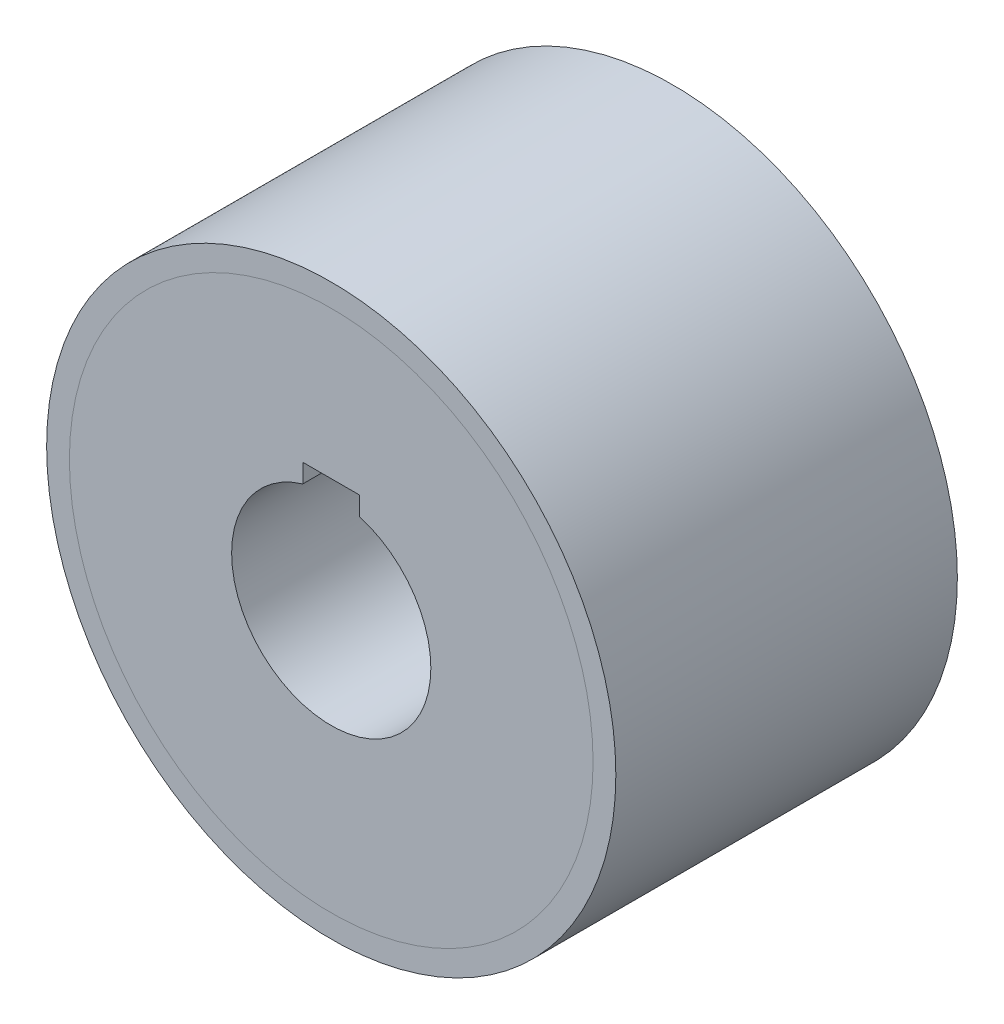
ISO-10303-21;
HEADER;
FILE_DESCRIPTION(('STEP AP214'),'2;1');
FILE_NAME('part.step','',(''),(''),'','','');
FILE_SCHEMA(('AUTOMOTIVE_DESIGN { 1 0 10303 214 1 1 1 1 }'));
ENDSEC;
DATA;
#1=APPLICATION_CONTEXT('core data for automotive mechanical design processes');
#2=APPLICATION_PROTOCOL_DEFINITION('international standard','automotive_design',2000,#1);
#3=PRODUCT_CONTEXT('',#1,'mechanical');
#4=PRODUCT('Part','Part','',(#3));
#5=PRODUCT_RELATED_PRODUCT_CATEGORY('part','',(#4));
#6=PRODUCT_DEFINITION_FORMATION('','',#4);
#7=PRODUCT_DEFINITION_CONTEXT('part definition',#1,'design');
#8=PRODUCT_DEFINITION('design','',#6,#7);
#9=PRODUCT_DEFINITION_SHAPE('','',#8);
#10=(LENGTH_UNIT() NAMED_UNIT(*) SI_UNIT(.MILLI.,.METRE.));
#11=(NAMED_UNIT(*) PLANE_ANGLE_UNIT() SI_UNIT($,.RADIAN.));
#12=(NAMED_UNIT(*) SI_UNIT($,.STERADIAN.) SOLID_ANGLE_UNIT());
#13=UNCERTAINTY_MEASURE_WITH_UNIT(LENGTH_MEASURE(1.E-05),#10,'distance_accuracy_value','');
#14=(GEOMETRIC_REPRESENTATION_CONTEXT(3) GLOBAL_UNCERTAINTY_ASSIGNED_CONTEXT((#13)) GLOBAL_UNIT_ASSIGNED_CONTEXT((#10,
#11,#12)) REPRESENTATION_CONTEXT('',''));
#15=CARTESIAN_POINT('',(0.,0.,0.));
#16=DIRECTION('',(0.,0.,1.));
#17=DIRECTION('',(1.,0.,0.));
#18=AXIS2_PLACEMENT_3D('',#15,#16,#17);
#19=CARTESIAN_POINT('',(0.,0.,201.42135623731));
#20=DIRECTION('',(0.,0.,-1.));
#21=DIRECTION('',(-1.,0.,0.));
#22=AXIS2_PLACEMENT_3D('',#19,#20,#21);
#23=CYLINDRICAL_SURFACE('',#22,50.);
#24=CARTESIAN_POINT('',(0.,0.,0.));
#25=DIRECTION('',(0.,0.,-1.));
#26=DIRECTION('',(-1.,0.,0.));
#27=AXIS2_PLACEMENT_3D('',#24,#25,#26);
#28=CIRCLE('',#27,50.);
#29=CARTESIAN_POINT('',(-50.,0.,0.));
#30=VERTEX_POINT('',#29);
#31=EDGE_CURVE('E66',#30,#30,#28,.T.);
#32=ORIENTED_EDGE('',*,*,#31,.F.);
#33=EDGE_LOOP('',(#32));
#34=FACE_BOUND('',#33,.T.);
#35=CARTESIAN_POINT('',(0.,0.,60.));
#36=DIRECTION('',(0.,0.,1.));
#37=DIRECTION('',(1.,0.,0.));
#38=AXIS2_PLACEMENT_3D('',#35,#36,#37);
#39=CIRCLE('',#38,50.);
#40=CARTESIAN_POINT('',(50.,0.,60.));
#41=VERTEX_POINT('',#40);
#42=EDGE_CURVE('E62',#41,#41,#39,.F.);
#43=ORIENTED_EDGE('',*,*,#42,.T.);
#44=EDGE_LOOP('',(#43));
#45=FACE_BOUND('',#44,.T.);
#46=ADVANCED_FACE('F58',(#34,#45),#23,.T.);
#47=CARTESIAN_POINT('',(0.,0.,201.42135623731));
#48=DIRECTION('',(0.,0.,-1.));
#49=DIRECTION('',(-1.,0.,0.));
#50=AXIS2_PLACEMENT_3D('',#47,#48,#49);
#51=CYLINDRICAL_SURFACE('',#50,46.);
#52=CARTESIAN_POINT('',(0.,0.,0.));
#53=DIRECTION('',(0.,0.,-1.));
#54=DIRECTION('',(-1.,0.,0.));
#55=AXIS2_PLACEMENT_3D('',#52,#53,#54);
#56=CIRCLE('',#55,46.);
#57=CARTESIAN_POINT('',(-46.,0.,0.));
#58=VERTEX_POINT('',#57);
#59=EDGE_CURVE('E70',#58,#58,#56,.T.);
#60=ORIENTED_EDGE('',*,*,#59,.T.);
#61=EDGE_LOOP('',(#60));
#62=FACE_BOUND('',#61,.T.);
#63=CARTESIAN_POINT('',(0.,0.,60.));
#64=DIRECTION('',(0.,0.,1.));
#65=DIRECTION('',(1.,0.,0.));
#66=AXIS2_PLACEMENT_3D('',#63,#64,#65);
#67=CIRCLE('',#66,46.);
#68=CARTESIAN_POINT('',(46.,0.,60.));
#69=VERTEX_POINT('',#68);
#70=EDGE_CURVE('E13',#69,#69,#67,.F.);
#71=ORIENTED_EDGE('',*,*,#70,.F.);
#72=EDGE_LOOP('',(#71));
#73=FACE_BOUND('',#72,.T.);
#74=ADVANCED_FACE('F85',(#62,#73),#51,.F.);
#75=CARTESIAN_POINT('',(0.,0.,0.));
#76=DIRECTION('',(0.,0.,-1.));
#77=DIRECTION('',(-1.,0.,0.));
#78=AXIS2_PLACEMENT_3D('',#75,#76,#77);
#79=PLANE('',#78);
#80=ORIENTED_EDGE('',*,*,#59,.F.);
#81=EDGE_LOOP('',(#80));
#82=FACE_BOUND('',#81,.T.);
#83=ORIENTED_EDGE('',*,*,#31,.T.);
#84=EDGE_LOOP('',(#83));
#85=FACE_BOUND('',#84,.T.);
#86=ADVANCED_FACE('F81',(#82,#85),#79,.T.);
#87=CARTESIAN_POINT('',(0.,0.,60.));
#88=DIRECTION('',(0.,0.,1.));
#89=DIRECTION('',(1.,0.,0.));
#90=AXIS2_PLACEMENT_3D('',#87,#88,#89);
#91=PLANE('',#90);
#92=ORIENTED_EDGE('',*,*,#42,.F.);
#93=EDGE_LOOP('',(#92));
#94=FACE_BOUND('',#93,.T.);
#95=ORIENTED_EDGE('',*,*,#70,.T.);
#96=EDGE_LOOP('',(#95));
#97=FACE_BOUND('',#96,.T.);
#98=ADVANCED_FACE('F60',(#94,#97),#91,.T.);
#99=CLOSED_SHELL('',(#46,#74,#86,#98));
#100=MANIFOLD_SOLID_BREP('B2',#99);
#101=CARTESIAN_POINT('',(0.,0.,60.));
#102=DIRECTION('',(0.,0.,-1.));
#103=DIRECTION('',(-1.,0.,0.));
#104=AXIS2_PLACEMENT_3D('',#101,#102,#103);
#105=CYLINDRICAL_SURFACE('',#104,46.);
#106=CARTESIAN_POINT('',(0.,0.,60.));
#107=DIRECTION('',(0.,0.,1.));
#108=DIRECTION('',(1.,0.,0.));
#109=AXIS2_PLACEMENT_3D('',#106,#107,#108);
#110=CIRCLE('',#109,46.);
#111=CARTESIAN_POINT('',(46.,0.,60.));
#112=VERTEX_POINT('',#111);
#113=EDGE_CURVE('E56',#112,#112,#110,.T.);
#114=ORIENTED_EDGE('',*,*,#113,.F.);
#115=EDGE_LOOP('',(#114));
#116=FACE_BOUND('',#115,.T.);
#117=CARTESIAN_POINT('',(0.,0.,0.));
#118=DIRECTION('',(0.,0.,1.));
#119=DIRECTION('',(1.,0.,0.));
#120=AXIS2_PLACEMENT_3D('',#117,#118,#119);
#121=CIRCLE('',#120,46.);
#122=CARTESIAN_POINT('',(46.,0.,0.));
#123=VERTEX_POINT('',#122);
#124=EDGE_CURVE('E120',#123,#123,#121,.T.);
#125=ORIENTED_EDGE('',*,*,#124,.T.);
#126=EDGE_LOOP('',(#125));
#127=FACE_BOUND('',#126,.T.);
#128=ADVANCED_FACE('F117',(#116,#127),#105,.T.);
#129=CARTESIAN_POINT('',(0.,0.,60.));
#130=DIRECTION('',(0.,0.,1.));
#131=DIRECTION('',(1.,0.,0.));
#132=AXIS2_PLACEMENT_3D('',#129,#130,#131);
#133=PLANE('',#132);
#134=DIRECTION('',(0.,-1.,0.));
#135=VECTOR('',#134,1.);
#136=CARTESIAN_POINT('',(5.,16.7705098312484,60.));
#137=LINE('',#136,#135);
#138=CARTESIAN_POINT('',(5.,20.0705098312484,60.));
#139=VERTEX_POINT('',#138);
#140=CARTESIAN_POINT('',(5.,16.7705098312484,60.));
#141=VERTEX_POINT('',#140);
#142=EDGE_CURVE('E173',#139,#141,#137,.T.);
#143=ORIENTED_EDGE('',*,*,#142,.T.);
#144=CARTESIAN_POINT('',(0.,0.,60.));
#145=DIRECTION('',(0.,0.,-1.));
#146=DIRECTION('',(-1.,0.,0.));
#147=AXIS2_PLACEMENT_3D('',#144,#145,#146);
#148=CIRCLE('',#147,17.5);
#149=CARTESIAN_POINT('',(-5.,16.7705098312484,60.));
#150=VERTEX_POINT('',#149);
#151=EDGE_CURVE('E179',#141,#150,#148,.T.);
#152=ORIENTED_EDGE('',*,*,#151,.T.);
#153=DIRECTION('',(0.,1.,0.));
#154=VECTOR('',#153,1.);
#155=CARTESIAN_POINT('',(-5.,16.7705098312484,60.));
#156=LINE('',#155,#154);
#157=CARTESIAN_POINT('',(-5.,20.0705098312484,60.));
#158=VERTEX_POINT('',#157);
#159=EDGE_CURVE('E131',#150,#158,#156,.T.);
#160=ORIENTED_EDGE('',*,*,#159,.T.);
#161=DIRECTION('',(1.,0.,0.));
#162=VECTOR('',#161,1.);
#163=CARTESIAN_POINT('',(5.,20.0705098312484,60.));
#164=LINE('',#163,#162);
#165=EDGE_CURVE('E170',#158,#139,#164,.T.);
#166=ORIENTED_EDGE('',*,*,#165,.T.);
#167=EDGE_LOOP('',(#143,#152,#160,#166));
#168=FACE_BOUND('',#167,.T.);
#169=ORIENTED_EDGE('',*,*,#113,.T.);
#170=EDGE_LOOP('',(#169));
#171=FACE_BOUND('',#170,.T.);
#172=ADVANCED_FACE('F176',(#168,#171),#133,.T.);
#173=CARTESIAN_POINT('',(0.,0.,0.));
#174=DIRECTION('',(0.,0.,1.));
#175=DIRECTION('',(1.,0.,0.));
#176=AXIS2_PLACEMENT_3D('',#173,#174,#175);
#177=PLANE('',#176);
#178=CARTESIAN_POINT('',(0.,0.,0.));
#179=DIRECTION('',(0.,0.,-1.));
#180=DIRECTION('',(-1.,0.,0.));
#181=AXIS2_PLACEMENT_3D('',#178,#179,#180);
#182=CIRCLE('',#181,17.5);
#183=CARTESIAN_POINT('',(5.,16.7705098312484,0.));
#184=VERTEX_POINT('',#183);
#185=CARTESIAN_POINT('',(-5.,16.7705098312484,0.));
#186=VERTEX_POINT('',#185);
#187=EDGE_CURVE('E188',#184,#186,#182,.T.);
#188=ORIENTED_EDGE('',*,*,#187,.F.);
#189=DIRECTION('',(0.,-1.,0.));
#190=VECTOR('',#189,1.);
#191=CARTESIAN_POINT('',(5.,16.7705098312484,0.));
#192=LINE('',#191,#190);
#193=CARTESIAN_POINT('',(5.,20.0705098312484,0.));
#194=VERTEX_POINT('',#193);
#195=EDGE_CURVE('E156',#194,#184,#192,.T.);
#196=ORIENTED_EDGE('',*,*,#195,.F.);
#197=DIRECTION('',(1.,0.,0.));
#198=VECTOR('',#197,1.);
#199=CARTESIAN_POINT('',(5.,20.0705098312484,0.));
#200=LINE('',#199,#198);
#201=CARTESIAN_POINT('',(-5.,20.0705098312484,0.));
#202=VERTEX_POINT('',#201);
#203=EDGE_CURVE('E181',#202,#194,#200,.T.);
#204=ORIENTED_EDGE('',*,*,#203,.F.);
#205=DIRECTION('',(0.,1.,0.));
#206=VECTOR('',#205,1.);
#207=CARTESIAN_POINT('',(-5.,16.7705098312484,0.));
#208=LINE('',#207,#206);
#209=EDGE_CURVE('E162',#186,#202,#208,.T.);
#210=ORIENTED_EDGE('',*,*,#209,.F.);
#211=EDGE_LOOP('',(#188,#196,#204,#210));
#212=FACE_BOUND('',#211,.T.);
#213=ORIENTED_EDGE('',*,*,#124,.F.);
#214=EDGE_LOOP('',(#213));
#215=FACE_BOUND('',#214,.T.);
#216=ADVANCED_FACE('F197',(#212,#215),#177,.F.);
#217=CARTESIAN_POINT('',(0.,0.,60.));
#218=DIRECTION('',(0.,0.,-1.));
#219=DIRECTION('',(-1.,0.,0.));
#220=AXIS2_PLACEMENT_3D('',#217,#218,#219);
#221=CYLINDRICAL_SURFACE('',#220,17.5);
#222=ORIENTED_EDGE('',*,*,#151,.F.);
#223=DIRECTION('',(0.,0.,-1.));
#224=VECTOR('',#223,1.);
#225=CARTESIAN_POINT('',(5.,16.7705098312484,60.));
#226=LINE('',#225,#224);
#227=EDGE_CURVE('E140',#141,#184,#226,.T.);
#228=ORIENTED_EDGE('',*,*,#227,.T.);
#229=ORIENTED_EDGE('',*,*,#187,.T.);
#230=DIRECTION('',(0.,0.,-1.));
#231=VECTOR('',#230,1.);
#232=CARTESIAN_POINT('',(-5.,16.7705098312484,60.));
#233=LINE('',#232,#231);
#234=EDGE_CURVE('E167',#150,#186,#233,.T.);
#235=ORIENTED_EDGE('',*,*,#234,.F.);
#236=EDGE_LOOP('',(#222,#228,#229,#235));
#237=FACE_BOUND('',#236,.T.);
#238=ADVANCED_FACE('F195',(#237),#221,.F.);
#239=CARTESIAN_POINT('',(5.,16.7705098312484,60.));
#240=DIRECTION('',(1.,0.,0.));
#241=DIRECTION('',(0.,0.,-1.));
#242=AXIS2_PLACEMENT_3D('',#239,#240,#241);
#243=PLANE('',#242);
#244=ORIENTED_EDGE('',*,*,#195,.T.);
#245=ORIENTED_EDGE('',*,*,#227,.F.);
#246=ORIENTED_EDGE('',*,*,#142,.F.);
#247=DIRECTION('',(0.,0.,-1.));
#248=VECTOR('',#247,1.);
#249=CARTESIAN_POINT('',(5.,20.0705098312484,60.));
#250=LINE('',#249,#248);
#251=EDGE_CURVE('E166',#139,#194,#250,.T.);
#252=ORIENTED_EDGE('',*,*,#251,.T.);
#253=EDGE_LOOP('',(#244,#245,#246,#252));
#254=FACE_BOUND('',#253,.T.);
#255=ADVANCED_FACE('F215',(#254),#243,.F.);
#256=CARTESIAN_POINT('',(5.,20.0705098312484,60.));
#257=DIRECTION('',(0.,1.,0.));
#258=DIRECTION('',(0.,0.,1.));
#259=AXIS2_PLACEMENT_3D('',#256,#257,#258);
#260=PLANE('',#259);
#261=ORIENTED_EDGE('',*,*,#203,.T.);
#262=ORIENTED_EDGE('',*,*,#251,.F.);
#263=ORIENTED_EDGE('',*,*,#165,.F.);
#264=DIRECTION('',(0.,0.,-1.));
#265=VECTOR('',#264,1.);
#266=CARTESIAN_POINT('',(-5.,20.0705098312484,60.));
#267=LINE('',#266,#265);
#268=EDGE_CURVE('E158',#158,#202,#267,.T.);
#269=ORIENTED_EDGE('',*,*,#268,.T.);
#270=EDGE_LOOP('',(#261,#262,#263,#269));
#271=FACE_BOUND('',#270,.T.);
#272=ADVANCED_FACE('F171',(#271),#260,.F.);
#273=CARTESIAN_POINT('',(-5.,16.7705098312484,60.));
#274=DIRECTION('',(-1.,0.,0.));
#275=DIRECTION('',(0.,0.,1.));
#276=AXIS2_PLACEMENT_3D('',#273,#274,#275);
#277=PLANE('',#276);
#278=ORIENTED_EDGE('',*,*,#209,.T.);
#279=ORIENTED_EDGE('',*,*,#268,.F.);
#280=ORIENTED_EDGE('',*,*,#159,.F.);
#281=ORIENTED_EDGE('',*,*,#234,.T.);
#282=EDGE_LOOP('',(#278,#279,#280,#281));
#283=FACE_BOUND('',#282,.T.);
#284=ADVANCED_FACE('F160',(#283),#277,.F.);
#285=CLOSED_SHELL('',(#128,#172,#216,#238,#255,#272,#284));
#286=MANIFOLD_SOLID_BREP('B8',#285);
#287=ADVANCED_BREP_SHAPE_REPRESENTATION('',(#18,#100,#286),#14);
#288=SHAPE_DEFINITION_REPRESENTATION(#9,#287);
ENDSEC;
END-ISO-10303-21;
